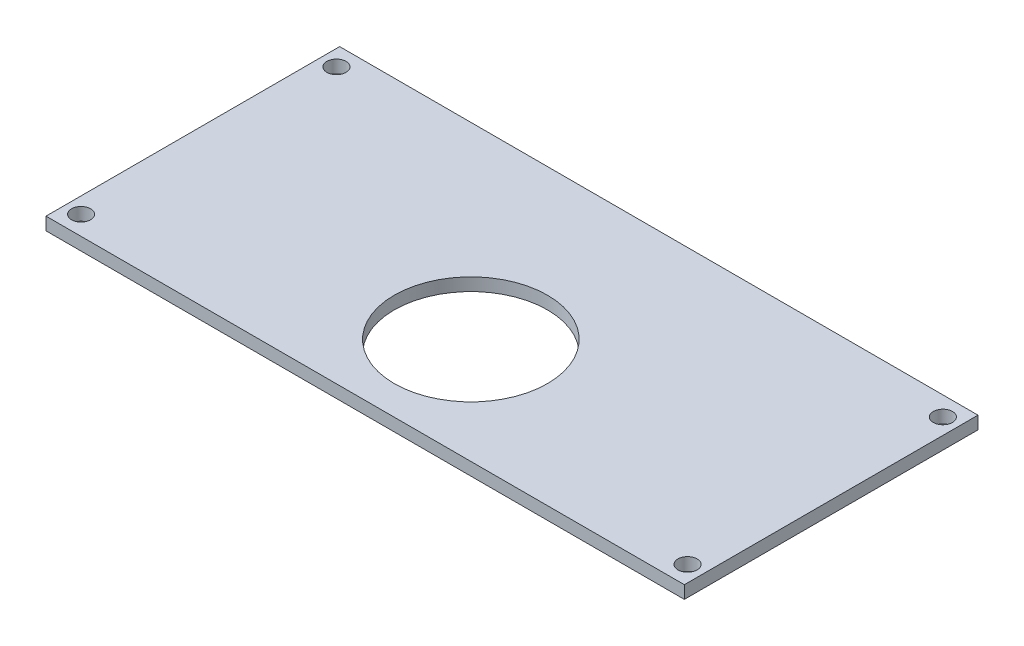
ISO-10303-21;
HEADER;
FILE_DESCRIPTION(('STEP AP214'),'2;1');
FILE_NAME('part.step','',(''),(''),'','','');
FILE_SCHEMA(('AUTOMOTIVE_DESIGN { 1 0 10303 214 1 1 1 1 }'));
ENDSEC;
DATA;
#1=APPLICATION_CONTEXT('core data for automotive mechanical design processes');
#2=APPLICATION_PROTOCOL_DEFINITION('international standard','automotive_design',2000,#1);
#3=PRODUCT_CONTEXT('',#1,'mechanical');
#4=PRODUCT('Part','Part','',(#3));
#5=PRODUCT_RELATED_PRODUCT_CATEGORY('part','',(#4));
#6=PRODUCT_DEFINITION_FORMATION('','',#4);
#7=PRODUCT_DEFINITION_CONTEXT('part definition',#1,'design');
#8=PRODUCT_DEFINITION('design','',#6,#7);
#9=PRODUCT_DEFINITION_SHAPE('','',#8);
#10=(LENGTH_UNIT() NAMED_UNIT(*) SI_UNIT(.MILLI.,.METRE.));
#11=(NAMED_UNIT(*) PLANE_ANGLE_UNIT() SI_UNIT($,.RADIAN.));
#12=(NAMED_UNIT(*) SI_UNIT($,.STERADIAN.) SOLID_ANGLE_UNIT());
#13=UNCERTAINTY_MEASURE_WITH_UNIT(LENGTH_MEASURE(1.E-05),#10,'distance_accuracy_value','');
#14=(GEOMETRIC_REPRESENTATION_CONTEXT(3) GLOBAL_UNCERTAINTY_ASSIGNED_CONTEXT((#13)) GLOBAL_UNIT_ASSIGNED_CONTEXT((#10,
#11,#12)) REPRESENTATION_CONTEXT('',''));
#15=CARTESIAN_POINT('',(0.,0.,0.));
#16=DIRECTION('',(0.,0.,1.));
#17=DIRECTION('',(1.,0.,0.));
#18=AXIS2_PLACEMENT_3D('',#15,#16,#17);
#19=CARTESIAN_POINT('',(0.,2.,0.));
#20=DIRECTION('',(0.,-1.,0.));
#21=DIRECTION('',(0.,0.,-1.));
#22=AXIS2_PLACEMENT_3D('',#19,#20,#21);
#23=PLANE('',#22);
#24=DIRECTION('',(0.,0.,1.));
#25=VECTOR('',#24,1.);
#26=CARTESIAN_POINT('',(0.,2.,0.));
#27=LINE('',#26,#25);
#28=CARTESIAN_POINT('',(0.,2.,-46.));
#29=VERTEX_POINT('',#28);
#30=CARTESIAN_POINT('',(0.,2.,0.));
#31=VERTEX_POINT('',#30);
#32=EDGE_CURVE('E93',#29,#31,#27,.T.);
#33=ORIENTED_EDGE('',*,*,#32,.T.);
#34=DIRECTION('',(1.,0.,0.));
#35=VECTOR('',#34,1.);
#36=CARTESIAN_POINT('',(0.,2.,0.));
#37=LINE('',#36,#35);
#38=CARTESIAN_POINT('',(100.,2.,0.));
#39=VERTEX_POINT('',#38);
#40=EDGE_CURVE('E88',#31,#39,#37,.T.);
#41=ORIENTED_EDGE('',*,*,#40,.T.);
#42=DIRECTION('',(0.,0.,-1.));
#43=VECTOR('',#42,1.);
#44=CARTESIAN_POINT('',(100.,2.,0.));
#45=LINE('',#44,#43);
#46=CARTESIAN_POINT('',(100.,2.,-46.));
#47=VERTEX_POINT('',#46);
#48=EDGE_CURVE('E91',#39,#47,#45,.T.);
#49=ORIENTED_EDGE('',*,*,#48,.T.);
#50=DIRECTION('',(-1.,0.,0.));
#51=VECTOR('',#50,1.);
#52=CARTESIAN_POINT('',(0.,2.,-46.));
#53=LINE('',#52,#51);
#54=EDGE_CURVE('E58',#47,#29,#53,.T.);
#55=ORIENTED_EDGE('',*,*,#54,.T.);
#56=EDGE_LOOP('',(#33,#41,#49,#55));
#57=FACE_BOUND('',#56,.T.);
#58=CARTESIAN_POINT('',(2.5,2.,-43.));
#59=DIRECTION('',(0.,1.,0.));
#60=DIRECTION('',(0.,0.,1.));
#61=AXIS2_PLACEMENT_3D('',#58,#59,#60);
#62=CIRCLE('',#61,1.5);
#63=CARTESIAN_POINT('',(2.5,2.,-41.5));
#64=VERTEX_POINT('',#63);
#65=EDGE_CURVE('E108',#64,#64,#62,.T.);
#66=ORIENTED_EDGE('',*,*,#65,.F.);
#67=EDGE_LOOP('',(#66));
#68=FACE_BOUND('',#67,.T.);
#69=CARTESIAN_POINT('',(2.5,2.,-3.));
#70=DIRECTION('',(0.,1.,0.));
#71=DIRECTION('',(0.,0.,-1.));
#72=AXIS2_PLACEMENT_3D('',#69,#70,#71);
#73=CIRCLE('',#72,1.5);
#74=CARTESIAN_POINT('',(2.5,2.,-4.5));
#75=VERTEX_POINT('',#74);
#76=EDGE_CURVE('E123',#75,#75,#73,.T.);
#77=ORIENTED_EDGE('',*,*,#76,.F.);
#78=EDGE_LOOP('',(#77));
#79=FACE_BOUND('',#78,.T.);
#80=CARTESIAN_POINT('',(97.5,2.,-3.));
#81=DIRECTION('',(0.,1.,0.));
#82=DIRECTION('',(0.,0.,1.));
#83=AXIS2_PLACEMENT_3D('',#80,#81,#82);
#84=CIRCLE('',#83,1.5);
#85=CARTESIAN_POINT('',(97.5,2.,-1.5));
#86=VERTEX_POINT('',#85);
#87=EDGE_CURVE('E129',#86,#86,#84,.T.);
#88=ORIENTED_EDGE('',*,*,#87,.F.);
#89=EDGE_LOOP('',(#88));
#90=FACE_BOUND('',#89,.T.);
#91=CARTESIAN_POINT('',(97.5,2.,-43.));
#92=DIRECTION('',(0.,1.,0.));
#93=DIRECTION('',(0.,0.,-1.));
#94=AXIS2_PLACEMENT_3D('',#91,#92,#93);
#95=CIRCLE('',#94,1.50000000000003);
#96=CARTESIAN_POINT('',(97.5,2.,-44.5));
#97=VERTEX_POINT('',#96);
#98=EDGE_CURVE('E135',#97,#97,#95,.T.);
#99=ORIENTED_EDGE('',*,*,#98,.F.);
#100=EDGE_LOOP('',(#99));
#101=FACE_BOUND('',#100,.T.);
#102=CARTESIAN_POINT('',(49.9999999999971,2.,-16.5563491861069));
#103=DIRECTION('',(0.,1.,0.));
#104=DIRECTION('',(0.,0.,1.));
#105=AXIS2_PLACEMENT_3D('',#102,#103,#104);
#106=CIRCLE('',#105,12.);
#107=CARTESIAN_POINT('',(49.9999999999971,2.,-4.55634918610685));
#108=VERTEX_POINT('',#107);
#109=EDGE_CURVE('E141',#108,#108,#106,.T.);
#110=ORIENTED_EDGE('',*,*,#109,.F.);
#111=EDGE_LOOP('',(#110));
#112=FACE_BOUND('',#111,.T.);
#113=ADVANCED_FACE('F41',(#57,#68,#79,#90,#101,#112),#23,.F.);
#114=CARTESIAN_POINT('',(0.,0.,0.));
#115=DIRECTION('',(0.,-1.,0.));
#116=DIRECTION('',(0.,0.,-1.));
#117=AXIS2_PLACEMENT_3D('',#114,#115,#116);
#118=PLANE('',#117);
#119=CARTESIAN_POINT('',(97.5,0.,-43.));
#120=DIRECTION('',(0.,1.,0.));
#121=DIRECTION('',(0.,0.,-1.));
#122=AXIS2_PLACEMENT_3D('',#119,#120,#121);
#123=CIRCLE('',#122,1.50000000000003);
#124=CARTESIAN_POINT('',(97.5,0.,-44.5));
#125=VERTEX_POINT('',#124);
#126=EDGE_CURVE('E138',#125,#125,#123,.T.);
#127=ORIENTED_EDGE('',*,*,#126,.T.);
#128=EDGE_LOOP('',(#127));
#129=FACE_BOUND('',#128,.T.);
#130=CARTESIAN_POINT('',(2.5,0.,-3.));
#131=DIRECTION('',(0.,1.,0.));
#132=DIRECTION('',(0.,0.,-1.));
#133=AXIS2_PLACEMENT_3D('',#130,#131,#132);
#134=CIRCLE('',#133,1.5);
#135=CARTESIAN_POINT('',(2.5,0.,-4.5));
#136=VERTEX_POINT('',#135);
#137=EDGE_CURVE('E126',#136,#136,#134,.T.);
#138=ORIENTED_EDGE('',*,*,#137,.T.);
#139=EDGE_LOOP('',(#138));
#140=FACE_BOUND('',#139,.T.);
#141=DIRECTION('',(0.,0.,1.));
#142=VECTOR('',#141,1.);
#143=CARTESIAN_POINT('',(0.,0.,0.));
#144=LINE('',#143,#142);
#145=CARTESIAN_POINT('',(0.,0.,-46.));
#146=VERTEX_POINT('',#145);
#147=CARTESIAN_POINT('',(0.,0.,0.));
#148=VERTEX_POINT('',#147);
#149=EDGE_CURVE('E105',#146,#148,#144,.T.);
#150=ORIENTED_EDGE('',*,*,#149,.F.);
#151=DIRECTION('',(-1.,0.,0.));
#152=VECTOR('',#151,1.);
#153=CARTESIAN_POINT('',(0.,0.,-46.));
#154=LINE('',#153,#152);
#155=CARTESIAN_POINT('',(100.,0.,-46.));
#156=VERTEX_POINT('',#155);
#157=EDGE_CURVE('E81',#156,#146,#154,.T.);
#158=ORIENTED_EDGE('',*,*,#157,.F.);
#159=DIRECTION('',(0.,0.,-1.));
#160=VECTOR('',#159,1.);
#161=CARTESIAN_POINT('',(100.,0.,0.));
#162=LINE('',#161,#160);
#163=CARTESIAN_POINT('',(100.,0.,0.));
#164=VERTEX_POINT('',#163);
#165=EDGE_CURVE('E75',#164,#156,#162,.T.);
#166=ORIENTED_EDGE('',*,*,#165,.F.);
#167=DIRECTION('',(1.,0.,0.));
#168=VECTOR('',#167,1.);
#169=CARTESIAN_POINT('',(0.,0.,0.));
#170=LINE('',#169,#168);
#171=EDGE_CURVE('E97',#148,#164,#170,.T.);
#172=ORIENTED_EDGE('',*,*,#171,.F.);
#173=EDGE_LOOP('',(#150,#158,#166,#172));
#174=FACE_BOUND('',#173,.T.);
#175=CARTESIAN_POINT('',(2.5,0.,-43.));
#176=DIRECTION('',(0.,1.,0.));
#177=DIRECTION('',(0.,0.,1.));
#178=AXIS2_PLACEMENT_3D('',#175,#176,#177);
#179=CIRCLE('',#178,1.5);
#180=CARTESIAN_POINT('',(2.5,0.,-41.5));
#181=VERTEX_POINT('',#180);
#182=EDGE_CURVE('E120',#181,#181,#179,.T.);
#183=ORIENTED_EDGE('',*,*,#182,.T.);
#184=EDGE_LOOP('',(#183));
#185=FACE_BOUND('',#184,.T.);
#186=CARTESIAN_POINT('',(97.5,0.,-3.));
#187=DIRECTION('',(0.,1.,0.));
#188=DIRECTION('',(0.,0.,1.));
#189=AXIS2_PLACEMENT_3D('',#186,#187,#188);
#190=CIRCLE('',#189,1.5);
#191=CARTESIAN_POINT('',(97.5,0.,-1.5));
#192=VERTEX_POINT('',#191);
#193=EDGE_CURVE('E132',#192,#192,#190,.T.);
#194=ORIENTED_EDGE('',*,*,#193,.T.);
#195=EDGE_LOOP('',(#194));
#196=FACE_BOUND('',#195,.T.);
#197=CARTESIAN_POINT('',(49.9999999999971,0.,-16.5563491861069));
#198=DIRECTION('',(0.,1.,0.));
#199=DIRECTION('',(0.,0.,1.));
#200=AXIS2_PLACEMENT_3D('',#197,#198,#199);
#201=CIRCLE('',#200,12.);
#202=CARTESIAN_POINT('',(49.9999999999971,0.,-4.55634918610685));
#203=VERTEX_POINT('',#202);
#204=EDGE_CURVE('E144',#203,#203,#201,.T.);
#205=ORIENTED_EDGE('',*,*,#204,.T.);
#206=EDGE_LOOP('',(#205));
#207=FACE_BOUND('',#206,.T.);
#208=ADVANCED_FACE('F116',(#129,#140,#174,#185,#196,#207),#118,.T.);
#209=CARTESIAN_POINT('',(0.,2.,0.));
#210=DIRECTION('',(1.,0.,0.));
#211=DIRECTION('',(0.,0.,-1.));
#212=AXIS2_PLACEMENT_3D('',#209,#210,#211);
#213=PLANE('',#212);
#214=ORIENTED_EDGE('',*,*,#149,.T.);
#215=DIRECTION('',(0.,-1.,0.));
#216=VECTOR('',#215,1.);
#217=CARTESIAN_POINT('',(0.,2.,0.));
#218=LINE('',#217,#216);
#219=EDGE_CURVE('E11',#31,#148,#218,.T.);
#220=ORIENTED_EDGE('',*,*,#219,.F.);
#221=ORIENTED_EDGE('',*,*,#32,.F.);
#222=DIRECTION('',(0.,-1.,0.));
#223=VECTOR('',#222,1.);
#224=CARTESIAN_POINT('',(0.,2.,-46.));
#225=LINE('',#224,#223);
#226=EDGE_CURVE('E101',#29,#146,#225,.T.);
#227=ORIENTED_EDGE('',*,*,#226,.T.);
#228=EDGE_LOOP('',(#214,#220,#221,#227));
#229=FACE_BOUND('',#228,.T.);
#230=ADVANCED_FACE('F43',(#229),#213,.F.);
#231=CARTESIAN_POINT('',(0.,2.,0.));
#232=DIRECTION('',(0.,0.,-1.));
#233=DIRECTION('',(-1.,0.,0.));
#234=AXIS2_PLACEMENT_3D('',#231,#232,#233);
#235=PLANE('',#234);
#236=ORIENTED_EDGE('',*,*,#171,.T.);
#237=DIRECTION('',(0.,-1.,0.));
#238=VECTOR('',#237,1.);
#239=CARTESIAN_POINT('',(100.,2.,0.));
#240=LINE('',#239,#238);
#241=EDGE_CURVE('E50',#39,#164,#240,.T.);
#242=ORIENTED_EDGE('',*,*,#241,.F.);
#243=ORIENTED_EDGE('',*,*,#40,.F.);
#244=ORIENTED_EDGE('',*,*,#219,.T.);
#245=EDGE_LOOP('',(#236,#242,#243,#244));
#246=FACE_BOUND('',#245,.T.);
#247=ADVANCED_FACE('F96',(#246),#235,.F.);
#248=CARTESIAN_POINT('',(100.,2.,0.));
#249=DIRECTION('',(-1.,0.,0.));
#250=DIRECTION('',(0.,0.,1.));
#251=AXIS2_PLACEMENT_3D('',#248,#249,#250);
#252=PLANE('',#251);
#253=ORIENTED_EDGE('',*,*,#165,.T.);
#254=DIRECTION('',(0.,-1.,0.));
#255=VECTOR('',#254,1.);
#256=CARTESIAN_POINT('',(100.,2.,-46.));
#257=LINE('',#256,#255);
#258=EDGE_CURVE('E98',#47,#156,#257,.T.);
#259=ORIENTED_EDGE('',*,*,#258,.F.);
#260=ORIENTED_EDGE('',*,*,#48,.F.);
#261=ORIENTED_EDGE('',*,*,#241,.T.);
#262=EDGE_LOOP('',(#253,#259,#260,#261));
#263=FACE_BOUND('',#262,.T.);
#264=ADVANCED_FACE('F99',(#263),#252,.F.);
#265=CARTESIAN_POINT('',(0.,2.,-46.));
#266=DIRECTION('',(0.,0.,1.));
#267=DIRECTION('',(1.,0.,0.));
#268=AXIS2_PLACEMENT_3D('',#265,#266,#267);
#269=PLANE('',#268);
#270=ORIENTED_EDGE('',*,*,#157,.T.);
#271=ORIENTED_EDGE('',*,*,#226,.F.);
#272=ORIENTED_EDGE('',*,*,#54,.F.);
#273=ORIENTED_EDGE('',*,*,#258,.T.);
#274=EDGE_LOOP('',(#270,#271,#272,#273));
#275=FACE_BOUND('',#274,.T.);
#276=ADVANCED_FACE('F113',(#275),#269,.F.);
#277=CARTESIAN_POINT('',(2.5,2.,-43.));
#278=DIRECTION('',(0.,-1.,0.));
#279=DIRECTION('',(0.,0.,-1.));
#280=AXIS2_PLACEMENT_3D('',#277,#278,#279);
#281=CYLINDRICAL_SURFACE('',#280,1.5);
#282=ORIENTED_EDGE('',*,*,#65,.T.);
#283=EDGE_LOOP('',(#282));
#284=FACE_BOUND('',#283,.T.);
#285=ORIENTED_EDGE('',*,*,#182,.F.);
#286=EDGE_LOOP('',(#285));
#287=FACE_BOUND('',#286,.T.);
#288=ADVANCED_FACE('F161',(#284,#287),#281,.F.);
#289=CARTESIAN_POINT('',(2.5,2.,-3.));
#290=DIRECTION('',(0.,-1.,0.));
#291=DIRECTION('',(0.,0.,-1.));
#292=AXIS2_PLACEMENT_3D('',#289,#290,#291);
#293=CYLINDRICAL_SURFACE('',#292,1.5);
#294=ORIENTED_EDGE('',*,*,#76,.T.);
#295=EDGE_LOOP('',(#294));
#296=FACE_BOUND('',#295,.T.);
#297=ORIENTED_EDGE('',*,*,#137,.F.);
#298=EDGE_LOOP('',(#297));
#299=FACE_BOUND('',#298,.T.);
#300=ADVANCED_FACE('F206',(#296,#299),#293,.F.);
#301=CARTESIAN_POINT('',(97.5,2.,-3.));
#302=DIRECTION('',(0.,-1.,0.));
#303=DIRECTION('',(0.,0.,-1.));
#304=AXIS2_PLACEMENT_3D('',#301,#302,#303);
#305=CYLINDRICAL_SURFACE('',#304,1.5);
#306=ORIENTED_EDGE('',*,*,#87,.T.);
#307=EDGE_LOOP('',(#306));
#308=FACE_BOUND('',#307,.T.);
#309=ORIENTED_EDGE('',*,*,#193,.F.);
#310=EDGE_LOOP('',(#309));
#311=FACE_BOUND('',#310,.T.);
#312=ADVANCED_FACE('F214',(#308,#311),#305,.F.);
#313=CARTESIAN_POINT('',(97.5,2.,-43.));
#314=DIRECTION('',(0.,-1.,0.));
#315=DIRECTION('',(0.,0.,-1.));
#316=AXIS2_PLACEMENT_3D('',#313,#314,#315);
#317=CYLINDRICAL_SURFACE('',#316,1.50000000000003);
#318=ORIENTED_EDGE('',*,*,#98,.T.);
#319=EDGE_LOOP('',(#318));
#320=FACE_BOUND('',#319,.T.);
#321=ORIENTED_EDGE('',*,*,#126,.F.);
#322=EDGE_LOOP('',(#321));
#323=FACE_BOUND('',#322,.T.);
#324=ADVANCED_FACE('F222',(#320,#323),#317,.F.);
#325=CARTESIAN_POINT('',(49.9999999999971,2.,-16.5563491861069));
#326=DIRECTION('',(0.,-1.,0.));
#327=DIRECTION('',(0.,0.,-1.));
#328=AXIS2_PLACEMENT_3D('',#325,#326,#327);
#329=CYLINDRICAL_SURFACE('',#328,12.);
#330=ORIENTED_EDGE('',*,*,#109,.T.);
#331=EDGE_LOOP('',(#330));
#332=FACE_BOUND('',#331,.T.);
#333=ORIENTED_EDGE('',*,*,#204,.F.);
#334=EDGE_LOOP('',(#333));
#335=FACE_BOUND('',#334,.T.);
#336=ADVANCED_FACE('F150',(#332,#335),#329,.F.);
#337=CLOSED_SHELL('',(#113,#208,#230,#247,#264,#276,#288,#300,#312,#324,#336));
#338=MANIFOLD_SOLID_BREP('B2',#337);
#339=ADVANCED_BREP_SHAPE_REPRESENTATION('',(#18,#338),#14);
#340=SHAPE_DEFINITION_REPRESENTATION(#9,#339);
ENDSEC;
END-ISO-10303-21;
